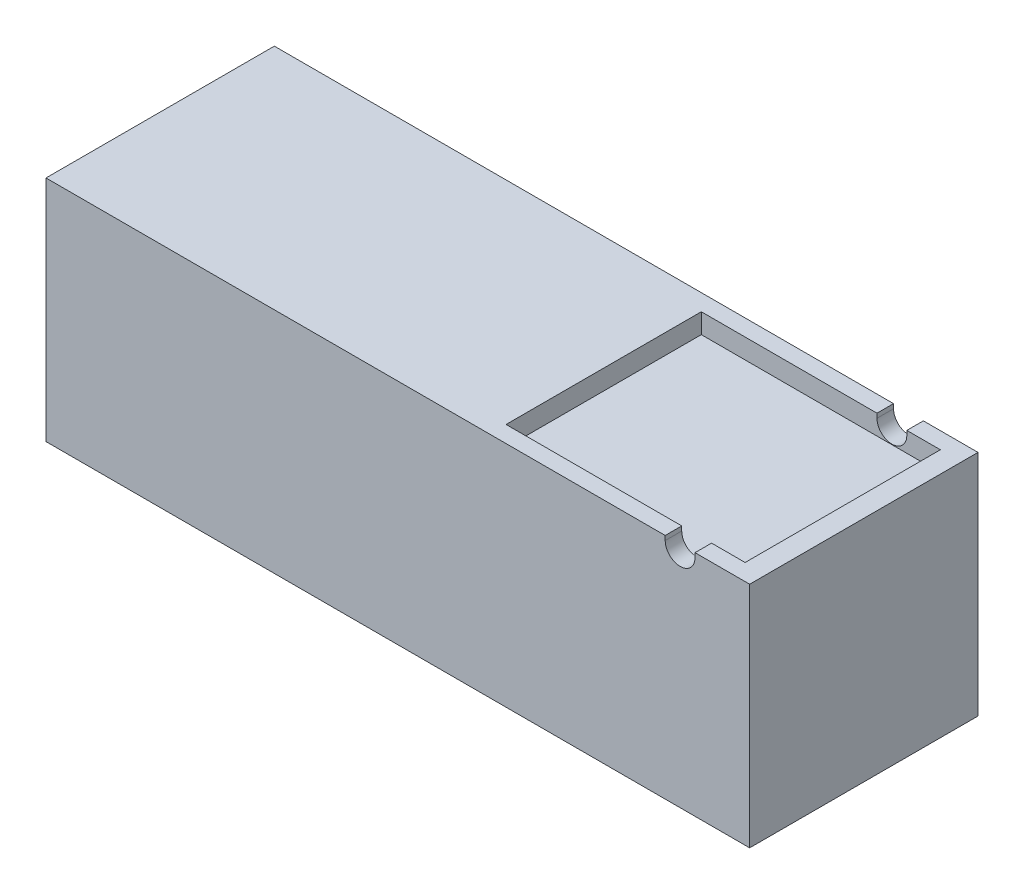
ISO-10303-21;
HEADER;
FILE_DESCRIPTION(('STEP AP214'),'2;1');
FILE_NAME('part.step','',(''),(''),'','','');
FILE_SCHEMA(('AUTOMOTIVE_DESIGN { 1 0 10303 214 1 1 1 1 }'));
ENDSEC;
DATA;
#1=APPLICATION_CONTEXT('core data for automotive mechanical design processes');
#2=APPLICATION_PROTOCOL_DEFINITION('international standard','automotive_design',2000,#1);
#3=PRODUCT_CONTEXT('',#1,'mechanical');
#4=PRODUCT('Part','Part','',(#3));
#5=PRODUCT_RELATED_PRODUCT_CATEGORY('part','',(#4));
#6=PRODUCT_DEFINITION_FORMATION('','',#4);
#7=PRODUCT_DEFINITION_CONTEXT('part definition',#1,'design');
#8=PRODUCT_DEFINITION('design','',#6,#7);
#9=PRODUCT_DEFINITION_SHAPE('','',#8);
#10=(LENGTH_UNIT() NAMED_UNIT(*) SI_UNIT(.MILLI.,.METRE.));
#11=(NAMED_UNIT(*) PLANE_ANGLE_UNIT() SI_UNIT($,.RADIAN.));
#12=(NAMED_UNIT(*) SI_UNIT($,.STERADIAN.) SOLID_ANGLE_UNIT());
#13=UNCERTAINTY_MEASURE_WITH_UNIT(LENGTH_MEASURE(1.E-05),#10,'distance_accuracy_value','');
#14=(GEOMETRIC_REPRESENTATION_CONTEXT(3) GLOBAL_UNCERTAINTY_ASSIGNED_CONTEXT((#13)) GLOBAL_UNIT_ASSIGNED_CONTEXT((#10,
#11,#12)) REPRESENTATION_CONTEXT('',''));
#15=CARTESIAN_POINT('',(0.,0.,0.));
#16=DIRECTION('',(0.,0.,1.));
#17=DIRECTION('',(1.,0.,0.));
#18=AXIS2_PLACEMENT_3D('',#15,#16,#17);
#19=CARTESIAN_POINT('',(0.,49.,0.));
#20=DIRECTION('',(0.,1.,0.));
#21=DIRECTION('',(0.,0.,1.));
#22=AXIS2_PLACEMENT_3D('',#19,#20,#21);
#23=PLANE('',#22);
#24=DIRECTION('',(0.,0.,-1.));
#25=VECTOR('',#24,1.);
#26=CARTESIAN_POINT('',(63.7740143646619,49.,24.5));
#27=LINE('',#26,#25);
#28=CARTESIAN_POINT('',(63.7740143646619,49.,24.5));
#29=VERTEX_POINT('',#28);
#30=CARTESIAN_POINT('',(63.7740143646619,49.,20.9500000000006));
#31=VERTEX_POINT('',#30);
#32=EDGE_CURVE('E315',#29,#31,#27,.T.);
#33=ORIENTED_EDGE('',*,*,#32,.F.);
#34=DIRECTION('',(1.,0.,0.));
#35=VECTOR('',#34,1.);
#36=CARTESIAN_POINT('',(-75.5,49.,24.5));
#37=LINE('',#36,#35);
#38=CARTESIAN_POINT('',(75.5,49.,24.5));
#39=VERTEX_POINT('',#38);
#40=EDGE_CURVE('E210',#29,#39,#37,.T.);
#41=ORIENTED_EDGE('',*,*,#40,.T.);
#42=DIRECTION('',(0.,0.,-1.));
#43=VECTOR('',#42,1.);
#44=CARTESIAN_POINT('',(75.5,49.,-24.5));
#45=LINE('',#44,#43);
#46=CARTESIAN_POINT('',(75.5,49.,-24.5));
#47=VERTEX_POINT('',#46);
#48=EDGE_CURVE('E198',#39,#47,#45,.T.);
#49=ORIENTED_EDGE('',*,*,#48,.T.);
#50=DIRECTION('',(-1.,0.,0.));
#51=VECTOR('',#50,1.);
#52=CARTESIAN_POINT('',(-75.5,49.,-24.5));
#53=LINE('',#52,#51);
#54=CARTESIAN_POINT('',(63.7740143646619,49.,-24.5));
#55=VERTEX_POINT('',#54);
#56=EDGE_CURVE('E206',#47,#55,#53,.T.);
#57=ORIENTED_EDGE('',*,*,#56,.T.);
#58=CARTESIAN_POINT('',(63.7740143646619,49.,-20.9500000000006));
#59=VERTEX_POINT('',#58);
#60=EDGE_CURVE('E320',#59,#55,#27,.T.);
#61=ORIENTED_EDGE('',*,*,#60,.F.);
#62=DIRECTION('',(-1.,0.,0.));
#63=VECTOR('',#62,1.);
#64=CARTESIAN_POINT('',(19.6744127986136,49.,-20.9500000000006));
#65=LINE('',#64,#63);
#66=CARTESIAN_POINT('',(70.9744127986133,49.,-20.9500000000006));
#67=VERTEX_POINT('',#66);
#68=EDGE_CURVE('E184',#67,#59,#65,.T.);
#69=ORIENTED_EDGE('',*,*,#68,.F.);
#70=DIRECTION('',(0.,0.,-1.));
#71=VECTOR('',#70,1.);
#72=CARTESIAN_POINT('',(70.9744127986133,49.,-20.9500000000006));
#73=LINE('',#72,#71);
#74=CARTESIAN_POINT('',(70.9744127986133,49.,20.9500000000006));
#75=VERTEX_POINT('',#74);
#76=EDGE_CURVE('E175',#75,#67,#73,.T.);
#77=ORIENTED_EDGE('',*,*,#76,.F.);
#78=DIRECTION('',(1.,0.,0.));
#79=VECTOR('',#78,1.);
#80=CARTESIAN_POINT('',(19.6744127986136,49.,20.9500000000006));
#81=LINE('',#80,#79);
#82=EDGE_CURVE('E154',#31,#75,#81,.T.);
#83=ORIENTED_EDGE('',*,*,#82,.F.);
#84=EDGE_LOOP('',(#33,#41,#49,#57,#61,#69,#77,#83));
#85=FACE_BOUND('',#84,.T.);
#86=ADVANCED_FACE('F42',(#85),#23,.T.);
#87=CARTESIAN_POINT('',(75.5,49.,-24.5));
#88=DIRECTION('',(-1.,0.,0.));
#89=DIRECTION('',(0.,0.,1.));
#90=AXIS2_PLACEMENT_3D('',#87,#88,#89);
#91=PLANE('',#90);
#92=DIRECTION('',(0.,0.,-1.));
#93=VECTOR('',#92,1.);
#94=CARTESIAN_POINT('',(75.5,0.,-24.5));
#95=LINE('',#94,#93);
#96=CARTESIAN_POINT('',(75.5,0.,24.5));
#97=VERTEX_POINT('',#96);
#98=CARTESIAN_POINT('',(75.5,0.,-24.5));
#99=VERTEX_POINT('',#98);
#100=EDGE_CURVE('E191',#97,#99,#95,.T.);
#101=ORIENTED_EDGE('',*,*,#100,.T.);
#102=DIRECTION('',(0.,-1.,0.));
#103=VECTOR('',#102,1.);
#104=CARTESIAN_POINT('',(75.5,49.,-24.5));
#105=LINE('',#104,#103);
#106=EDGE_CURVE('E237',#47,#99,#105,.T.);
#107=ORIENTED_EDGE('',*,*,#106,.F.);
#108=ORIENTED_EDGE('',*,*,#48,.F.);
#109=DIRECTION('',(0.,-1.,0.));
#110=VECTOR('',#109,1.);
#111=CARTESIAN_POINT('',(75.5,49.,24.5));
#112=LINE('',#111,#110);
#113=EDGE_CURVE('E214',#39,#97,#112,.T.);
#114=ORIENTED_EDGE('',*,*,#113,.T.);
#115=EDGE_LOOP('',(#101,#107,#108,#114));
#116=FACE_BOUND('',#115,.T.);
#117=ADVANCED_FACE('F44',(#116),#91,.F.);
#118=CARTESIAN_POINT('',(-75.5,49.,-24.5));
#119=DIRECTION('',(0.,0.,1.));
#120=DIRECTION('',(1.,0.,0.));
#121=AXIS2_PLACEMENT_3D('',#118,#119,#120);
#122=PLANE('',#121);
#123=CARTESIAN_POINT('',(60.5740143646619,48.05,-24.5));
#124=DIRECTION('',(0.,0.,-1.));
#125=DIRECTION('',(-1.,0.,0.));
#126=AXIS2_PLACEMENT_3D('',#123,#124,#125);
#127=CIRCLE('',#126,3.2);
#128=CARTESIAN_POINT('',(63.7740143646619,48.05,-24.5));
#129=VERTEX_POINT('',#128);
#130=CARTESIAN_POINT('',(57.3740143646619,48.05,-24.5));
#131=VERTEX_POINT('',#130);
#132=EDGE_CURVE('E46',#129,#131,#127,.T.);
#133=ORIENTED_EDGE('',*,*,#132,.F.);
#134=DIRECTION('',(0.,1.,0.));
#135=VECTOR('',#134,1.);
#136=CARTESIAN_POINT('',(63.7740143646619,48.05,-24.5));
#137=LINE('',#136,#135);
#138=EDGE_CURVE('E84',#55,#129,#137,.F.);
#139=ORIENTED_EDGE('',*,*,#138,.F.);
#140=ORIENTED_EDGE('',*,*,#56,.F.);
#141=ORIENTED_EDGE('',*,*,#106,.T.);
#142=DIRECTION('',(-1.,0.,0.));
#143=VECTOR('',#142,1.);
#144=CARTESIAN_POINT('',(-75.5,0.,-24.5));
#145=LINE('',#144,#143);
#146=CARTESIAN_POINT('',(-75.5,0.,-24.5));
#147=VERTEX_POINT('',#146);
#148=EDGE_CURVE('E218',#99,#147,#145,.T.);
#149=ORIENTED_EDGE('',*,*,#148,.T.);
#150=DIRECTION('',(0.,-1.,0.));
#151=VECTOR('',#150,1.);
#152=CARTESIAN_POINT('',(-75.5,49.,-24.5));
#153=LINE('',#152,#151);
#154=CARTESIAN_POINT('',(-75.5,49.,-24.5));
#155=VERTEX_POINT('',#154);
#156=EDGE_CURVE('E233',#155,#147,#153,.T.);
#157=ORIENTED_EDGE('',*,*,#156,.F.);
#158=CARTESIAN_POINT('',(57.3740143646619,49.,-24.5));
#159=VERTEX_POINT('',#158);
#160=EDGE_CURVE('E202',#159,#155,#53,.T.);
#161=ORIENTED_EDGE('',*,*,#160,.F.);
#162=DIRECTION('',(0.,1.,0.));
#163=VECTOR('',#162,1.);
#164=CARTESIAN_POINT('',(57.3740143646619,48.05,-24.5));
#165=LINE('',#164,#163);
#166=EDGE_CURVE('E246',#131,#159,#165,.T.);
#167=ORIENTED_EDGE('',*,*,#166,.F.);
#168=EDGE_LOOP('',(#133,#139,#140,#141,#149,#157,#161,#167));
#169=FACE_BOUND('',#168,.T.);
#170=ADVANCED_FACE('F283',(#169),#122,.F.);
#171=CARTESIAN_POINT('',(-75.5,49.,-24.5));
#172=DIRECTION('',(1.,0.,0.));
#173=DIRECTION('',(0.,0.,-1.));
#174=AXIS2_PLACEMENT_3D('',#171,#172,#173);
#175=PLANE('',#174);
#176=DIRECTION('',(0.,0.,1.));
#177=VECTOR('',#176,1.);
#178=CARTESIAN_POINT('',(-75.5,0.,-24.5));
#179=LINE('',#178,#177);
#180=CARTESIAN_POINT('',(-75.5,0.,24.5));
#181=VERTEX_POINT('',#180);
#182=EDGE_CURVE('E221',#147,#181,#179,.T.);
#183=ORIENTED_EDGE('',*,*,#182,.T.);
#184=DIRECTION('',(0.,-1.,0.));
#185=VECTOR('',#184,1.);
#186=CARTESIAN_POINT('',(-75.5,49.,24.5));
#187=LINE('',#186,#185);
#188=CARTESIAN_POINT('',(-75.5,49.,24.5));
#189=VERTEX_POINT('',#188);
#190=EDGE_CURVE('E229',#189,#181,#187,.T.);
#191=ORIENTED_EDGE('',*,*,#190,.F.);
#192=DIRECTION('',(0.,0.,1.));
#193=VECTOR('',#192,1.);
#194=CARTESIAN_POINT('',(-75.5,49.,-24.5));
#195=LINE('',#194,#193);
#196=EDGE_CURVE('E207',#155,#189,#195,.T.);
#197=ORIENTED_EDGE('',*,*,#196,.F.);
#198=ORIENTED_EDGE('',*,*,#156,.T.);
#199=EDGE_LOOP('',(#183,#191,#197,#198));
#200=FACE_BOUND('',#199,.T.);
#201=ADVANCED_FACE('F288',(#200),#175,.F.);
#202=CARTESIAN_POINT('',(-75.5,49.,24.5));
#203=DIRECTION('',(0.,0.,-1.));
#204=DIRECTION('',(-1.,0.,0.));
#205=AXIS2_PLACEMENT_3D('',#202,#203,#204);
#206=PLANE('',#205);
#207=ORIENTED_EDGE('',*,*,#40,.F.);
#208=DIRECTION('',(0.,-1.,0.));
#209=VECTOR('',#208,1.);
#210=CARTESIAN_POINT('',(63.7740143646619,48.05,24.5));
#211=LINE('',#210,#209);
#212=CARTESIAN_POINT('',(63.7740143646619,48.05,24.5));
#213=VERTEX_POINT('',#212);
#214=EDGE_CURVE('E307',#29,#213,#211,.T.);
#215=ORIENTED_EDGE('',*,*,#214,.T.);
#216=CARTESIAN_POINT('',(60.5740143646619,48.05,24.5));
#217=DIRECTION('',(0.,0.,-1.));
#218=DIRECTION('',(-1.,0.,0.));
#219=AXIS2_PLACEMENT_3D('',#216,#217,#218);
#220=CIRCLE('',#219,3.2);
#221=CARTESIAN_POINT('',(57.3740143646619,48.05,24.5));
#222=VERTEX_POINT('',#221);
#223=EDGE_CURVE('E304',#213,#222,#220,.T.);
#224=ORIENTED_EDGE('',*,*,#223,.T.);
#225=DIRECTION('',(0.,1.,0.));
#226=VECTOR('',#225,1.);
#227=CARTESIAN_POINT('',(57.3740143646619,48.05,24.5));
#228=LINE('',#227,#226);
#229=CARTESIAN_POINT('',(57.3740143646619,49.,24.5));
#230=VERTEX_POINT('',#229);
#231=EDGE_CURVE('E301',#222,#230,#228,.T.);
#232=ORIENTED_EDGE('',*,*,#231,.T.);
#233=EDGE_CURVE('E211',#189,#230,#37,.T.);
#234=ORIENTED_EDGE('',*,*,#233,.F.);
#235=ORIENTED_EDGE('',*,*,#190,.T.);
#236=DIRECTION('',(1.,0.,0.));
#237=VECTOR('',#236,1.);
#238=CARTESIAN_POINT('',(-75.5,0.,24.5));
#239=LINE('',#238,#237);
#240=EDGE_CURVE('E203',#181,#97,#239,.T.);
#241=ORIENTED_EDGE('',*,*,#240,.T.);
#242=ORIENTED_EDGE('',*,*,#113,.F.);
#243=EDGE_LOOP('',(#207,#215,#224,#232,#234,#235,#241,#242));
#244=FACE_BOUND('',#243,.T.);
#245=ADVANCED_FACE('F297',(#244),#206,.F.);
#246=DIRECTION('',(0.,0.,-1.));
#247=VECTOR('',#246,1.);
#248=CARTESIAN_POINT('',(57.3740143646619,49.,24.5));
#249=LINE('',#248,#247);
#250=CARTESIAN_POINT('',(57.3740143646619,49.,-20.9500000000006));
#251=VERTEX_POINT('',#250);
#252=EDGE_CURVE('E62',#251,#159,#249,.T.);
#253=ORIENTED_EDGE('',*,*,#252,.T.);
#254=ORIENTED_EDGE('',*,*,#160,.T.);
#255=ORIENTED_EDGE('',*,*,#196,.T.);
#256=ORIENTED_EDGE('',*,*,#233,.T.);
#257=CARTESIAN_POINT('',(57.3740143646619,49.,20.9500000000006));
#258=VERTEX_POINT('',#257);
#259=EDGE_CURVE('E173',#230,#258,#249,.T.);
#260=ORIENTED_EDGE('',*,*,#259,.T.);
#261=CARTESIAN_POINT('',(19.6744127986136,49.,20.9500000000006));
#262=VERTEX_POINT('',#261);
#263=EDGE_CURVE('E161',#262,#258,#81,.T.);
#264=ORIENTED_EDGE('',*,*,#263,.F.);
#265=DIRECTION('',(0.,0.,1.));
#266=VECTOR('',#265,1.);
#267=CARTESIAN_POINT('',(19.6744127986136,49.,-20.9500000000006));
#268=LINE('',#267,#266);
#269=CARTESIAN_POINT('',(19.6744127986136,49.,-20.9500000000006));
#270=VERTEX_POINT('',#269);
#271=EDGE_CURVE('E143',#270,#262,#268,.T.);
#272=ORIENTED_EDGE('',*,*,#271,.F.);
#273=EDGE_CURVE('E180',#251,#270,#65,.T.);
#274=ORIENTED_EDGE('',*,*,#273,.F.);
#275=EDGE_LOOP('',(#253,#254,#255,#256,#260,#264,#272,#274));
#276=FACE_BOUND('',#275,.T.);
#277=ADVANCED_FACE('F170',(#276),#23,.T.);
#278=CARTESIAN_POINT('',(0.,0.,0.));
#279=DIRECTION('',(0.,1.,0.));
#280=DIRECTION('',(0.,0.,1.));
#281=AXIS2_PLACEMENT_3D('',#278,#279,#280);
#282=PLANE('',#281);
#283=ORIENTED_EDGE('',*,*,#100,.F.);
#284=ORIENTED_EDGE('',*,*,#240,.F.);
#285=ORIENTED_EDGE('',*,*,#182,.F.);
#286=ORIENTED_EDGE('',*,*,#148,.F.);
#287=EDGE_LOOP('',(#283,#284,#285,#286));
#288=FACE_BOUND('',#287,.T.);
#289=ADVANCED_FACE('F344',(#288),#282,.F.);
#290=CARTESIAN_POINT('',(19.6744127986136,44.7404,-20.9500000000006));
#291=DIRECTION('',(-1.,0.,0.));
#292=DIRECTION('',(0.,0.,1.));
#293=AXIS2_PLACEMENT_3D('',#290,#291,#292);
#294=PLANE('',#293);
#295=ORIENTED_EDGE('',*,*,#271,.T.);
#296=DIRECTION('',(0.,1.,0.));
#297=VECTOR('',#296,1.);
#298=CARTESIAN_POINT('',(19.6744127986136,44.7404,20.9500000000006));
#299=LINE('',#298,#297);
#300=CARTESIAN_POINT('',(19.6744127986136,44.7404,20.9500000000006));
#301=VERTEX_POINT('',#300);
#302=EDGE_CURVE('E147',#301,#262,#299,.T.);
#303=ORIENTED_EDGE('',*,*,#302,.F.);
#304=DIRECTION('',(0.,0.,1.));
#305=VECTOR('',#304,1.);
#306=CARTESIAN_POINT('',(19.6744127986136,44.7404,-20.9500000000006));
#307=LINE('',#306,#305);
#308=CARTESIAN_POINT('',(19.6744127986136,44.7404,-20.9500000000006));
#309=VERTEX_POINT('',#308);
#310=EDGE_CURVE('E188',#309,#301,#307,.T.);
#311=ORIENTED_EDGE('',*,*,#310,.F.);
#312=DIRECTION('',(0.,1.,0.));
#313=VECTOR('',#312,1.);
#314=CARTESIAN_POINT('',(19.6744127986136,44.7404,-20.9500000000006));
#315=LINE('',#314,#313);
#316=EDGE_CURVE('E149',#309,#270,#315,.T.);
#317=ORIENTED_EDGE('',*,*,#316,.T.);
#318=EDGE_LOOP('',(#295,#303,#311,#317));
#319=FACE_BOUND('',#318,.T.);
#320=ADVANCED_FACE('F145',(#319),#294,.F.);
#321=CARTESIAN_POINT('',(19.6744127986136,44.7404,-20.9500000000006));
#322=DIRECTION('',(0.,0.,-1.));
#323=DIRECTION('',(-1.,0.,0.));
#324=AXIS2_PLACEMENT_3D('',#321,#322,#323);
#325=PLANE('',#324);
#326=ORIENTED_EDGE('',*,*,#68,.T.);
#327=DIRECTION('',(0.,-1.,0.));
#328=VECTOR('',#327,1.);
#329=CARTESIAN_POINT('',(63.7740143646619,44.7404,-20.9500000000006));
#330=LINE('',#329,#328);
#331=CARTESIAN_POINT('',(63.7740143646619,48.05,-20.9500000000006));
#332=VERTEX_POINT('',#331);
#333=EDGE_CURVE('E248',#59,#332,#330,.T.);
#334=ORIENTED_EDGE('',*,*,#333,.T.);
#335=CARTESIAN_POINT('',(60.5740143646619,48.05,-20.9500000000006));
#336=DIRECTION('',(0.,0.,-1.));
#337=DIRECTION('',(-1.,0.,0.));
#338=AXIS2_PLACEMENT_3D('',#335,#336,#337);
#339=CIRCLE('',#338,3.2);
#340=CARTESIAN_POINT('',(57.3740143646619,48.05,-20.9500000000006));
#341=VERTEX_POINT('',#340);
#342=EDGE_CURVE('E94',#332,#341,#339,.T.);
#343=ORIENTED_EDGE('',*,*,#342,.T.);
#344=DIRECTION('',(0.,1.,0.));
#345=VECTOR('',#344,1.);
#346=CARTESIAN_POINT('',(57.3740143646619,44.7404,-20.9500000000006));
#347=LINE('',#346,#345);
#348=EDGE_CURVE('E249',#341,#251,#347,.T.);
#349=ORIENTED_EDGE('',*,*,#348,.T.);
#350=ORIENTED_EDGE('',*,*,#273,.T.);
#351=ORIENTED_EDGE('',*,*,#316,.F.);
#352=DIRECTION('',(-1.,0.,0.));
#353=VECTOR('',#352,1.);
#354=CARTESIAN_POINT('',(19.6744127986136,44.7404,-20.9500000000006));
#355=LINE('',#354,#353);
#356=CARTESIAN_POINT('',(70.9744127986133,44.7404,-20.9500000000006));
#357=VERTEX_POINT('',#356);
#358=EDGE_CURVE('E167',#357,#309,#355,.T.);
#359=ORIENTED_EDGE('',*,*,#358,.F.);
#360=DIRECTION('',(0.,1.,0.));
#361=VECTOR('',#360,1.);
#362=CARTESIAN_POINT('',(70.9744127986133,44.7404,-20.9500000000006));
#363=LINE('',#362,#361);
#364=EDGE_CURVE('E192',#357,#67,#363,.T.);
#365=ORIENTED_EDGE('',*,*,#364,.T.);
#366=EDGE_LOOP('',(#326,#334,#343,#349,#350,#351,#359,#365));
#367=FACE_BOUND('',#366,.T.);
#368=ADVANCED_FACE('F274',(#367),#325,.F.);
#369=CARTESIAN_POINT('',(70.9744127986133,44.7404,-20.9500000000006));
#370=DIRECTION('',(1.,0.,0.));
#371=DIRECTION('',(0.,0.,-1.));
#372=AXIS2_PLACEMENT_3D('',#369,#370,#371);
#373=PLANE('',#372);
#374=ORIENTED_EDGE('',*,*,#76,.T.);
#375=ORIENTED_EDGE('',*,*,#364,.F.);
#376=DIRECTION('',(0.,0.,-1.));
#377=VECTOR('',#376,1.);
#378=CARTESIAN_POINT('',(70.9744127986133,44.7404,-20.9500000000006));
#379=LINE('',#378,#377);
#380=CARTESIAN_POINT('',(70.9744127986133,44.7404,20.9500000000006));
#381=VERTEX_POINT('',#380);
#382=EDGE_CURVE('E265',#381,#357,#379,.T.);
#383=ORIENTED_EDGE('',*,*,#382,.F.);
#384=DIRECTION('',(0.,1.,0.));
#385=VECTOR('',#384,1.);
#386=CARTESIAN_POINT('',(70.9744127986133,44.7404,20.9500000000006));
#387=LINE('',#386,#385);
#388=EDGE_CURVE('E166',#381,#75,#387,.T.);
#389=ORIENTED_EDGE('',*,*,#388,.T.);
#390=EDGE_LOOP('',(#374,#375,#383,#389));
#391=FACE_BOUND('',#390,.T.);
#392=ADVANCED_FACE('F365',(#391),#373,.F.);
#393=CARTESIAN_POINT('',(19.6744127986136,44.7404,20.9500000000006));
#394=DIRECTION('',(0.,0.,1.));
#395=DIRECTION('',(1.,0.,0.));
#396=AXIS2_PLACEMENT_3D('',#393,#394,#395);
#397=PLANE('',#396);
#398=CARTESIAN_POINT('',(60.5740143646619,48.05,20.9500000000006));
#399=DIRECTION('',(0.,0.,1.));
#400=DIRECTION('',(1.,0.,0.));
#401=AXIS2_PLACEMENT_3D('',#398,#399,#400);
#402=CIRCLE('',#401,3.2);
#403=CARTESIAN_POINT('',(57.3740143646619,48.05,20.9500000000006));
#404=VERTEX_POINT('',#403);
#405=CARTESIAN_POINT('',(63.7740143646619,48.05,20.9500000000006));
#406=VERTEX_POINT('',#405);
#407=EDGE_CURVE('E53',#404,#406,#402,.T.);
#408=ORIENTED_EDGE('',*,*,#407,.T.);
#409=DIRECTION('',(0.,1.,0.));
#410=VECTOR('',#409,1.);
#411=CARTESIAN_POINT('',(63.7740143646619,44.7404,20.9500000000006));
#412=LINE('',#411,#410);
#413=EDGE_CURVE('E11',#406,#31,#412,.T.);
#414=ORIENTED_EDGE('',*,*,#413,.T.);
#415=ORIENTED_EDGE('',*,*,#82,.T.);
#416=ORIENTED_EDGE('',*,*,#388,.F.);
#417=DIRECTION('',(1.,0.,0.));
#418=VECTOR('',#417,1.);
#419=CARTESIAN_POINT('',(19.6744127986136,44.7404,20.9500000000006));
#420=LINE('',#419,#418);
#421=EDGE_CURVE('E163',#301,#381,#420,.T.);
#422=ORIENTED_EDGE('',*,*,#421,.F.);
#423=ORIENTED_EDGE('',*,*,#302,.T.);
#424=ORIENTED_EDGE('',*,*,#263,.T.);
#425=DIRECTION('',(0.,-1.,0.));
#426=VECTOR('',#425,1.);
#427=CARTESIAN_POINT('',(57.3740143646619,44.7404,20.9500000000006));
#428=LINE('',#427,#426);
#429=EDGE_CURVE('E241',#258,#404,#428,.T.);
#430=ORIENTED_EDGE('',*,*,#429,.T.);
#431=EDGE_LOOP('',(#408,#414,#415,#416,#422,#423,#424,#430));
#432=FACE_BOUND('',#431,.T.);
#433=ADVANCED_FACE('F159',(#432),#397,.F.);
#434=CARTESIAN_POINT('',(0.,44.7404,0.));
#435=DIRECTION('',(0.,1.,0.));
#436=DIRECTION('',(0.,0.,1.));
#437=AXIS2_PLACEMENT_3D('',#434,#435,#436);
#438=PLANE('',#437);
#439=ORIENTED_EDGE('',*,*,#310,.T.);
#440=ORIENTED_EDGE('',*,*,#421,.T.);
#441=ORIENTED_EDGE('',*,*,#382,.T.);
#442=ORIENTED_EDGE('',*,*,#358,.T.);
#443=EDGE_LOOP('',(#439,#440,#441,#442));
#444=FACE_BOUND('',#443,.T.);
#445=ADVANCED_FACE('F272',(#444),#438,.T.);
#446=CARTESIAN_POINT('',(63.7740143646619,48.05,24.5));
#447=DIRECTION('',(1.,0.,0.));
#448=DIRECTION('',(0.,0.,-1.));
#449=AXIS2_PLACEMENT_3D('',#446,#447,#448);
#450=PLANE('',#449);
#451=DIRECTION('',(0.,0.,-1.));
#452=VECTOR('',#451,1.);
#453=CARTESIAN_POINT('',(63.7740143646619,48.05,24.5));
#454=LINE('',#453,#452);
#455=EDGE_CURVE('E321',#213,#406,#454,.T.);
#456=ORIENTED_EDGE('',*,*,#455,.F.);
#457=ORIENTED_EDGE('',*,*,#214,.F.);
#458=ORIENTED_EDGE('',*,*,#32,.T.);
#459=ORIENTED_EDGE('',*,*,#413,.F.);
#460=EDGE_LOOP('',(#456,#457,#458,#459));
#461=FACE_BOUND('',#460,.T.);
#462=ADVANCED_FACE('F373',(#461),#450,.F.);
#463=CARTESIAN_POINT('',(57.3740143646619,48.05,24.5));
#464=DIRECTION('',(-1.,0.,0.));
#465=DIRECTION('',(0.,0.,1.));
#466=AXIS2_PLACEMENT_3D('',#463,#464,#465);
#467=PLANE('',#466);
#468=ORIENTED_EDGE('',*,*,#259,.F.);
#469=ORIENTED_EDGE('',*,*,#231,.F.);
#470=DIRECTION('',(0.,0.,-1.));
#471=VECTOR('',#470,1.);
#472=CARTESIAN_POINT('',(57.3740143646619,48.05,24.5));
#473=LINE('',#472,#471);
#474=EDGE_CURVE('E279',#222,#404,#473,.T.);
#475=ORIENTED_EDGE('',*,*,#474,.T.);
#476=ORIENTED_EDGE('',*,*,#429,.F.);
#477=EDGE_LOOP('',(#468,#469,#475,#476));
#478=FACE_BOUND('',#477,.T.);
#479=ADVANCED_FACE('F381',(#478),#467,.F.);
#480=CARTESIAN_POINT('',(60.5740143646619,48.05,24.5));
#481=DIRECTION('',(0.,0.,-1.));
#482=DIRECTION('',(-1.,0.,0.));
#483=AXIS2_PLACEMENT_3D('',#480,#481,#482);
#484=CYLINDRICAL_SURFACE('',#483,3.2);
#485=ORIENTED_EDGE('',*,*,#474,.F.);
#486=ORIENTED_EDGE('',*,*,#223,.F.);
#487=ORIENTED_EDGE('',*,*,#455,.T.);
#488=ORIENTED_EDGE('',*,*,#407,.F.);
#489=EDGE_LOOP('',(#485,#486,#487,#488));
#490=FACE_BOUND('',#489,.T.);
#491=ADVANCED_FACE('F377',(#490),#484,.F.);
#492=EDGE_CURVE('E311',#341,#131,#473,.T.);
#493=ORIENTED_EDGE('',*,*,#492,.F.);
#494=ORIENTED_EDGE('',*,*,#342,.F.);
#495=EDGE_CURVE('E319',#332,#129,#454,.T.);
#496=ORIENTED_EDGE('',*,*,#495,.T.);
#497=ORIENTED_EDGE('',*,*,#132,.T.);
#498=EDGE_LOOP('',(#493,#494,#496,#497));
#499=FACE_BOUND('',#498,.T.);
#500=ADVANCED_FACE('F374',(#499),#484,.F.);
#501=ORIENTED_EDGE('',*,*,#495,.F.);
#502=ORIENTED_EDGE('',*,*,#333,.F.);
#503=ORIENTED_EDGE('',*,*,#60,.T.);
#504=ORIENTED_EDGE('',*,*,#138,.T.);
#505=EDGE_LOOP('',(#501,#502,#503,#504));
#506=FACE_BOUND('',#505,.T.);
#507=ADVANCED_FACE('F329',(#506),#450,.F.);
#508=ORIENTED_EDGE('',*,*,#252,.F.);
#509=ORIENTED_EDGE('',*,*,#348,.F.);
#510=ORIENTED_EDGE('',*,*,#492,.T.);
#511=ORIENTED_EDGE('',*,*,#166,.T.);
#512=EDGE_LOOP('',(#508,#509,#510,#511));
#513=FACE_BOUND('',#512,.T.);
#514=ADVANCED_FACE('F378',(#513),#467,.F.);
#515=CLOSED_SHELL('',(#86,#117,#170,#201,#245,#277,#289,#320,#368,#392,#433,#445,#462,#479,#491,
#500,#507,#514));
#516=MANIFOLD_SOLID_BREP('B2',#515);
#517=ADVANCED_BREP_SHAPE_REPRESENTATION('',(#18,#516),#14);
#518=SHAPE_DEFINITION_REPRESENTATION(#9,#517);
ENDSEC;
END-ISO-10303-21;
